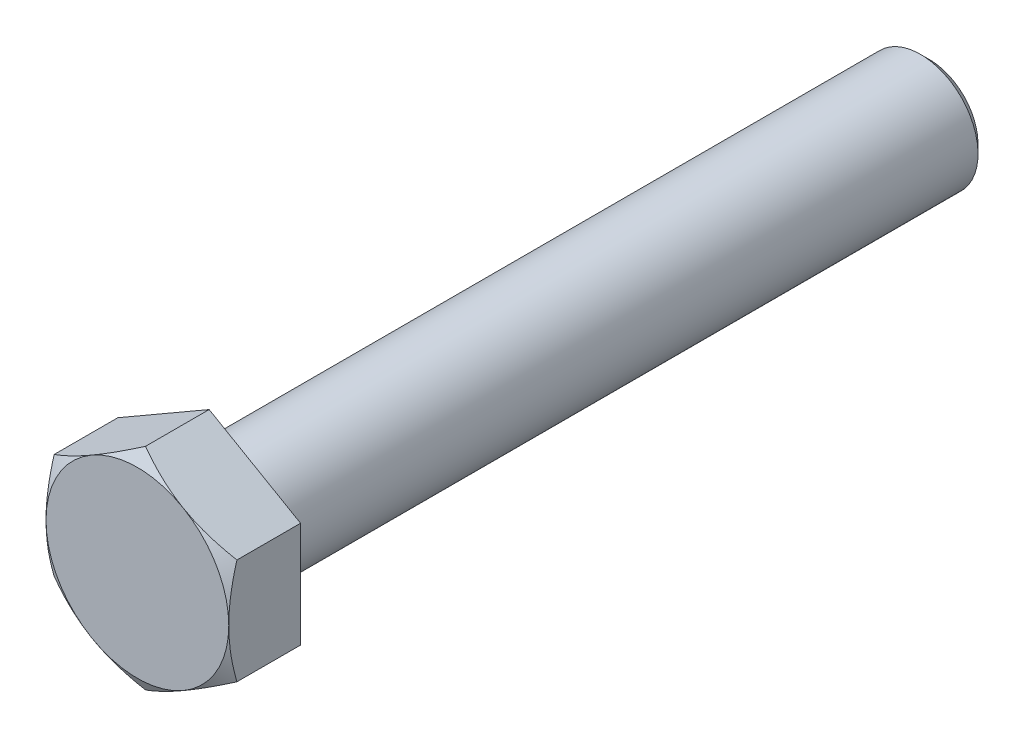
ISO-10303-21;
HEADER;
FILE_DESCRIPTION(('STEP AP214'),'2;1');
FILE_NAME('part.step','',(''),(''),'','','');
FILE_SCHEMA(('AUTOMOTIVE_DESIGN { 1 0 10303 214 1 1 1 1 }'));
ENDSEC;
DATA;
#1=APPLICATION_CONTEXT('core data for automotive mechanical design processes');
#2=APPLICATION_PROTOCOL_DEFINITION('international standard','automotive_design',2000,#1);
#3=PRODUCT_CONTEXT('',#1,'mechanical');
#4=PRODUCT('Part','Part','',(#3));
#5=PRODUCT_RELATED_PRODUCT_CATEGORY('part','',(#4));
#6=PRODUCT_DEFINITION_FORMATION('','',#4);
#7=PRODUCT_DEFINITION_CONTEXT('part definition',#1,'design');
#8=PRODUCT_DEFINITION('design','',#6,#7);
#9=PRODUCT_DEFINITION_SHAPE('','',#8);
#10=(LENGTH_UNIT() NAMED_UNIT(*) SI_UNIT(.MILLI.,.METRE.));
#11=(NAMED_UNIT(*) PLANE_ANGLE_UNIT() SI_UNIT($,.RADIAN.));
#12=(NAMED_UNIT(*) SI_UNIT($,.STERADIAN.) SOLID_ANGLE_UNIT());
#13=UNCERTAINTY_MEASURE_WITH_UNIT(LENGTH_MEASURE(1.E-05),#10,'distance_accuracy_value','');
#14=(GEOMETRIC_REPRESENTATION_CONTEXT(3) GLOBAL_UNCERTAINTY_ASSIGNED_CONTEXT((#13)) GLOBAL_UNIT_ASSIGNED_CONTEXT((#10,
#11,#12)) REPRESENTATION_CONTEXT('',''));
#15=CARTESIAN_POINT('',(0.,0.,0.));
#16=DIRECTION('',(0.,0.,1.));
#17=DIRECTION('',(1.,0.,0.));
#18=AXIS2_PLACEMENT_3D('',#15,#16,#17);
#19=CARTESIAN_POINT('',(0.,0.,0.));
#20=DIRECTION('',(0.,0.,1.));
#21=DIRECTION('',(1.,0.,0.));
#22=AXIS2_PLACEMENT_3D('',#19,#20,#21);
#23=PLANE('',#22);
#24=CARTESIAN_POINT('',(0.,0.,0.));
#25=DIRECTION('',(0.,0.,1.));
#26=DIRECTION('',(0.,-1.,0.));
#27=AXIS2_PLACEMENT_3D('',#24,#25,#26);
#28=CIRCLE('',#27,4.6);
#29=CARTESIAN_POINT('',(0.,-4.6,0.));
#30=VERTEX_POINT('',#29);
#31=EDGE_CURVE('E150',#30,#30,#28,.T.);
#32=ORIENTED_EDGE('',*,*,#31,.T.);
#33=EDGE_LOOP('',(#32));
#34=FACE_BOUND('',#33,.T.);
#35=CARTESIAN_POINT('',(0.,0.,0.));
#36=DIRECTION('',(0.,0.,1.));
#37=DIRECTION('',(1.,0.,0.));
#38=AXIS2_PLACEMENT_3D('',#35,#36,#37);
#39=CIRCLE('',#38,5.8);
#40=CARTESIAN_POINT('',(5.8,0.,0.));
#41=VERTEX_POINT('',#40);
#42=EDGE_CURVE('E296',#41,#41,#39,.T.);
#43=ORIENTED_EDGE('',*,*,#42,.F.);
#44=EDGE_LOOP('',(#43));
#45=FACE_BOUND('',#44,.T.);
#46=ADVANCED_FACE('F41',(#34,#45),#23,.F.);
#47=CARTESIAN_POINT('',(0.,0.,-0.6));
#48=DIRECTION('',(0.,0.,1.));
#49=DIRECTION('',(0.,-1.,0.));
#50=AXIS2_PLACEMENT_3D('',#47,#48,#49);
#51=TOROIDAL_SURFACE('',#50,4.6,0.600000000000001);
#52=ORIENTED_EDGE('',*,*,#31,.F.);
#53=EDGE_LOOP('',(#52));
#54=FACE_BOUND('',#53,.T.);
#55=CARTESIAN_POINT('',(0.,0.,-0.6));
#56=DIRECTION('',(0.,0.,1.));
#57=DIRECTION('',(0.,-1.,0.));
#58=AXIS2_PLACEMENT_3D('',#55,#56,#57);
#59=CIRCLE('',#58,4.);
#60=CARTESIAN_POINT('',(0.,-4.,-0.6));
#61=VERTEX_POINT('',#60);
#62=EDGE_CURVE('E153',#61,#61,#59,.T.);
#63=ORIENTED_EDGE('',*,*,#62,.T.);
#64=EDGE_LOOP('',(#63));
#65=FACE_BOUND('',#64,.T.);
#66=ADVANCED_FACE('F237',(#54,#65),#51,.F.);
#67=CARTESIAN_POINT('',(0.,0.,0.));
#68=DIRECTION('',(0.,0.,1.));
#69=DIRECTION('',(0.,-1.,0.));
#70=AXIS2_PLACEMENT_3D('',#67,#68,#69);
#71=CYLINDRICAL_SURFACE('',#70,4.);
#72=ORIENTED_EDGE('',*,*,#62,.F.);
#73=EDGE_LOOP('',(#72));
#74=FACE_BOUND('',#73,.T.);
#75=CARTESIAN_POINT('',(0.,0.,-49.4));
#76=DIRECTION('',(0.,0.,1.));
#77=DIRECTION('',(0.,-1.,0.));
#78=AXIS2_PLACEMENT_3D('',#75,#76,#77);
#79=CIRCLE('',#78,4.00000000000001);
#80=CARTESIAN_POINT('',(0.,-4.00000000000001,-49.4));
#81=VERTEX_POINT('',#80);
#82=EDGE_CURVE('E156',#81,#81,#79,.T.);
#83=ORIENTED_EDGE('',*,*,#82,.T.);
#84=EDGE_LOOP('',(#83));
#85=FACE_BOUND('',#84,.T.);
#86=ADVANCED_FACE('F243',(#74,#85),#71,.T.);
#87=CARTESIAN_POINT('',(0.,0.,-50.));
#88=DIRECTION('',(0.,0.,1.));
#89=DIRECTION('',(0.,-1.,0.));
#90=AXIS2_PLACEMENT_3D('',#87,#88,#89);
#91=CONICAL_SURFACE('',#90,3.4,0.785398163397444);
#92=ORIENTED_EDGE('',*,*,#82,.F.);
#93=EDGE_LOOP('',(#92));
#94=FACE_BOUND('',#93,.T.);
#95=CARTESIAN_POINT('',(0.,0.,-50.));
#96=DIRECTION('',(0.,0.,1.));
#97=DIRECTION('',(0.,-1.,0.));
#98=AXIS2_PLACEMENT_3D('',#95,#96,#97);
#99=CIRCLE('',#98,3.4);
#100=CARTESIAN_POINT('',(0.,-3.4,-50.));
#101=VERTEX_POINT('',#100);
#102=EDGE_CURVE('E129',#101,#101,#99,.T.);
#103=ORIENTED_EDGE('',*,*,#102,.T.);
#104=EDGE_LOOP('',(#103));
#105=FACE_BOUND('',#104,.T.);
#106=ADVANCED_FACE('F310',(#94,#105),#91,.T.);
#107=CARTESIAN_POINT('',(0.,3.4,-50.));
#108=DIRECTION('',(0.,0.,1.));
#109=DIRECTION('',(0.,-1.,0.));
#110=AXIS2_PLACEMENT_3D('',#107,#108,#109);
#111=PLANE('',#110);
#112=ORIENTED_EDGE('',*,*,#102,.F.);
#113=EDGE_LOOP('',(#112));
#114=FACE_BOUND('',#113,.T.);
#115=ADVANCED_FACE('F306',(#114),#111,.F.);
#116=CARTESIAN_POINT('',(0.,7.34966892678394,0.150000000000001));
#117=DIRECTION('',(0.,0.,-1.));
#118=DIRECTION('',(-1.,0.,0.));
#119=AXIS2_PLACEMENT_3D('',#116,#117,#118);
#120=PLANE('',#119);
#121=CARTESIAN_POINT('',(0.,0.,0.150000000000001));
#122=DIRECTION('',(0.,0.,1.));
#123=DIRECTION('',(1.,0.,0.));
#124=AXIS2_PLACEMENT_3D('',#121,#122,#123);
#125=CIRCLE('',#124,5.88660254037844);
#126=CARTESIAN_POINT('',(5.88660254037844,0.,0.150000000000001));
#127=VERTEX_POINT('',#126);
#128=EDGE_CURVE('E293',#127,#127,#125,.T.);
#129=ORIENTED_EDGE('',*,*,#128,.T.);
#130=EDGE_LOOP('',(#129));
#131=FACE_BOUND('',#130,.T.);
#132=DIRECTION('',(0.866025403784439,-0.5,0.));
#133=VECTOR('',#132,1.);
#134=CARTESIAN_POINT('',(6.365,3.67483446339197,0.150000000000001));
#135=LINE('',#134,#133);
#136=CARTESIAN_POINT('',(0.,7.34966892678394,0.150000000000001));
#137=VERTEX_POINT('',#136);
#138=CARTESIAN_POINT('',(6.365,3.67483446339197,0.150000000000003));
#139=VERTEX_POINT('',#138);
#140=EDGE_CURVE('E64',#137,#139,#135,.T.);
#141=ORIENTED_EDGE('',*,*,#140,.T.);
#142=DIRECTION('',(0.,-1.,0.));
#143=VECTOR('',#142,1.);
#144=CARTESIAN_POINT('',(6.365,-3.67483446339197,0.150000000000001));
#145=LINE('',#144,#143);
#146=CARTESIAN_POINT('',(6.365,-3.67483446339197,0.150000000000001));
#147=VERTEX_POINT('',#146);
#148=EDGE_CURVE('E11',#139,#147,#145,.T.);
#149=ORIENTED_EDGE('',*,*,#148,.T.);
#150=DIRECTION('',(-0.866025403784439,-0.5,0.));
#151=VECTOR('',#150,1.);
#152=CARTESIAN_POINT('',(0.,-7.34966892678394,0.150000000000001));
#153=LINE('',#152,#151);
#154=CARTESIAN_POINT('',(0.,-7.34966892678394,0.150000000000001));
#155=VERTEX_POINT('',#154);
#156=EDGE_CURVE('E164',#147,#155,#153,.T.);
#157=ORIENTED_EDGE('',*,*,#156,.T.);
#158=DIRECTION('',(-0.866025403784438,0.5,0.));
#159=VECTOR('',#158,1.);
#160=CARTESIAN_POINT('',(-6.365,-3.67483446339197,0.150000000000001));
#161=LINE('',#160,#159);
#162=CARTESIAN_POINT('',(-6.365,-3.67483446339197,0.150000000000001));
#163=VERTEX_POINT('',#162);
#164=EDGE_CURVE('E162',#155,#163,#161,.T.);
#165=ORIENTED_EDGE('',*,*,#164,.T.);
#166=DIRECTION('',(0.,1.,0.));
#167=VECTOR('',#166,1.);
#168=CARTESIAN_POINT('',(-6.365,3.67483446339197,0.150000000000001));
#169=LINE('',#168,#167);
#170=CARTESIAN_POINT('',(-6.365,3.67483446339197,0.150000000000001));
#171=VERTEX_POINT('',#170);
#172=EDGE_CURVE('E115',#163,#171,#169,.T.);
#173=ORIENTED_EDGE('',*,*,#172,.T.);
#174=DIRECTION('',(0.866025403784439,0.5,0.));
#175=VECTOR('',#174,1.);
#176=CARTESIAN_POINT('',(0.,7.34966892678394,0.150000000000001));
#177=LINE('',#176,#175);
#178=EDGE_CURVE('E112',#171,#137,#177,.T.);
#179=ORIENTED_EDGE('',*,*,#178,.T.);
#180=EDGE_LOOP('',(#141,#149,#157,#165,#173,#179));
#181=FACE_BOUND('',#180,.T.);
#182=ADVANCED_FACE('F113',(#131,#181),#120,.T.);
#183=CARTESIAN_POINT('',(0.,0.,0.150000000000001));
#184=DIRECTION('',(0.,0.,1.));
#185=DIRECTION('',(1.,0.,0.));
#186=AXIS2_PLACEMENT_3D('',#183,#184,#185);
#187=CONICAL_SURFACE('',#186,5.88660254037844,0.523598775598302);
#188=ORIENTED_EDGE('',*,*,#42,.T.);
#189=EDGE_LOOP('',(#188));
#190=FACE_BOUND('',#189,.T.);
#191=ORIENTED_EDGE('',*,*,#128,.F.);
#192=EDGE_LOOP('',(#191));
#193=FACE_BOUND('',#192,.T.);
#194=ADVANCED_FACE('F188',(#190,#193),#187,.T.);
#195=CARTESIAN_POINT('',(6.365,-3.67483446339197,5.15));
#196=DIRECTION('',(-1.,0.,0.));
#197=DIRECTION('',(0.,0.,1.));
#198=AXIS2_PLACEMENT_3D('',#195,#196,#197);
#199=PLANE('',#198);
#200=CARTESIAN_POINT('',(6.365,-9.74620255402201,2.10417752070093));
#201=CARTESIAN_POINT('',(6.365,-9.466743061924,2.23922778450705));
#202=CARTESIAN_POINT('',(6.365,-9.18662283336427,2.37293553637398));
#203=CARTESIAN_POINT('',(6.365,-8.62470364838083,2.63689885997666));
#204=CARTESIAN_POINT('',(6.365,-8.34290441151386,2.76715383400582));
#205=CARTESIAN_POINT('',(6.365,-7.77574769826276,3.02413063602513));
#206=CARTESIAN_POINT('',(6.365,-7.49037908790233,3.15082797964364));
#207=CARTESIAN_POINT('',(6.365,-6.91729637209056,3.39878070466244));
#208=CARTESIAN_POINT('',(6.365,-6.62958238982508,3.52003636972724));
#209=CARTESIAN_POINT('',(6.365,-6.04777966328442,3.75709828240193));
#210=CARTESIAN_POINT('',(6.365,-5.75365602159666,3.87281935215871));
#211=CARTESIAN_POINT('',(6.365,-5.16193930006325,4.09519817931673));
#212=CARTESIAN_POINT('',(6.365,-4.864345838395,4.20185492835972));
#213=CARTESIAN_POINT('',(6.365,-4.26582830474239,4.40323957299992));
#214=CARTESIAN_POINT('',(6.365,-3.96491285237291,4.49799282927845));
#215=CARTESIAN_POINT('',(6.365,-3.35880092538506,4.67249210660028));
#216=CARTESIAN_POINT('',(6.365,-3.05360583750632,4.75224287346636));
#217=CARTESIAN_POINT('',(6.365,-2.4387408862867,4.89286958916527));
#218=CARTESIAN_POINT('',(6.365,-2.12906985440494,4.95374051233359));
#219=CARTESIAN_POINT('',(6.365,-1.50595084883235,5.05249385747353));
#220=CARTESIAN_POINT('',(6.365,-1.19250287180248,5.0903762591204));
#221=CARTESIAN_POINT('',(6.365,-0.721832091587363,5.12753002038573));
#222=CARTESIAN_POINT('',(6.365,-0.565346043942449,5.13663818585123));
#223=CARTESIAN_POINT('',(6.365,-0.252121475645643,5.14822358924696));
#224=CARTESIAN_POINT('',(6.365,-0.0953829582988802,5.15070091328813));
#225=CARTESIAN_POINT('',(6.365,0.218011475278281,5.14895808707227));
#226=CARTESIAN_POINT('',(6.365,0.374667402345122,5.14473981644265));
#227=CARTESIAN_POINT('',(6.365,0.687665429465813,5.12971270573269));
#228=CARTESIAN_POINT('',(6.365,0.84400751345634,5.11890353652779));
#229=CARTESIAN_POINT('',(6.365,1.22293245370947,5.08494297431608));
#230=CARTESIAN_POINT('',(6.365,1.445224118384,5.05848904503914));
#231=CARTESIAN_POINT('',(6.365,1.88810410746324,4.99372467120738));
#232=CARTESIAN_POINT('',(6.365,2.10869195007896,4.95541099043317));
#233=CARTESIAN_POINT('',(6.365,2.54798223572799,4.86828591240334));
#234=CARTESIAN_POINT('',(6.365,2.76668269133518,4.81946458949067));
#235=CARTESIAN_POINT('',(6.365,3.20183348991462,4.71281384098773));
#236=CARTESIAN_POINT('',(6.365,3.41828404281129,4.65498526400403));
#237=CARTESIAN_POINT('',(6.365,3.85426615972078,4.53019185361869));
#238=CARTESIAN_POINT('',(6.365,4.07374319251582,4.46303781689891));
#239=CARTESIAN_POINT('',(6.365,4.5103773806417,4.32209453671705));
#240=CARTESIAN_POINT('',(6.365,4.72753602208682,4.24830986982301));
#241=CARTESIAN_POINT('',(6.365,5.15866204869266,4.09562942366593));
#242=CARTESIAN_POINT('',(6.365,5.37264051637927,4.01676475081889));
#243=CARTESIAN_POINT('',(6.365,5.79893727559048,3.85440649793558));
#244=CARTESIAN_POINT('',(6.365,6.01125485600017,3.77091104705295));
#245=CARTESIAN_POINT('',(6.365,6.22280111012557,3.68555829334041));
#246=B_SPLINE_CURVE_WITH_KNOTS('',3,(#200,#201,#202,#203,#204,#205,#206,#207,#208,#209,#210,
#211,#212,#213,#214,#215,#216,#217,#218,#219,#220,#221,#222,#223,#224,#225,#226,#227,#228,#229,
#230,#231,#232,#233,#234,#235,#236,#237,#238,#239,#240,#241,#242,#243,#244,#245),.UNSPECIFIED.,
.F.,.F.,(4,2,2,2,2,2,2,2,2,2,2,2,2,2,2,2,2,2,2,2,2,2,4),(0.,0.931154614866976,1.86246938194105,
2.79911368730425,3.73570911030725,4.68380301837242,5.63200225924,6.57814578450031,
7.52398950564165,8.47008478721693,9.41618090525813,9.88631422449018,10.3564414383406,
10.8264366986048,11.2964554305782,11.9676621628092,12.6390522116941,13.3110792699478,
13.9830430523123,14.6714781192221,15.3594416141425,16.0435327883289,16.7279023793783),.UNSPECIFIED.);
#247=CARTESIAN_POINT('',(6.365,-3.67483446339197,4.58150113005864));
#248=VERTEX_POINT('',#247);
#249=CARTESIAN_POINT('',(6.365,0.,5.15));
#250=VERTEX_POINT('',#249);
#251=EDGE_CURVE('E291',#248,#250,#246,.T.);
#252=ORIENTED_EDGE('',*,*,#251,.F.);
#253=DIRECTION('',(0.,0.,-1.));
#254=VECTOR('',#253,1.);
#255=CARTESIAN_POINT('',(6.365,-3.67483446339197,5.15));
#256=LINE('',#255,#254);
#257=EDGE_CURVE('E146',#248,#147,#256,.T.);
#258=ORIENTED_EDGE('',*,*,#257,.T.);
#259=ORIENTED_EDGE('',*,*,#148,.F.);
#260=DIRECTION('',(0.,0.,-1.));
#261=VECTOR('',#260,1.);
#262=CARTESIAN_POINT('',(6.365,3.67483446339197,5.15));
#263=LINE('',#262,#261);
#264=CARTESIAN_POINT('',(6.365,3.67483446339197,4.58150113005864));
#265=VERTEX_POINT('',#264);
#266=EDGE_CURVE('E128',#265,#139,#263,.T.);
#267=ORIENTED_EDGE('',*,*,#266,.F.);
#268=EDGE_CURVE('E193',#250,#265,#246,.T.);
#269=ORIENTED_EDGE('',*,*,#268,.F.);
#270=EDGE_LOOP('',(#252,#258,#259,#267,#269));
#271=FACE_BOUND('',#270,.T.);
#272=ADVANCED_FACE('F248',(#271),#199,.F.);
#273=CARTESIAN_POINT('',(0.,-7.34966892678394,5.15));
#274=DIRECTION('',(-0.5,0.866025403784439,0.));
#275=DIRECTION('',(-0.866025403784439,-0.5,0.));
#276=AXIS2_PLACEMENT_3D('',#273,#274,#275);
#277=PLANE('',#276);
#278=CARTESIAN_POINT('',(-0.000200000000001205,-7.34978439683778,4.58143446182091));
#279=CARTESIAN_POINT('',(0.139710039115643,-7.26900729809203,4.6280643413956));
#280=CARTESIAN_POINT('',(0.280141730709852,-7.18792902314736,4.67257800061253));
#281=CARTESIAN_POINT('',(0.562145571657771,-7.02511402966357,4.75679002639063));
#282=CARTESIAN_POINT('',(0.703718185116129,-6.94337704317351,4.79648631569877));
#283=CARTESIAN_POINT('',(1.13070279037378,-6.69685736638818,4.90756995845888));
#284=CARTESIAN_POINT('',(1.41780023937635,-6.53110157692289,4.97075318530501));
#285=CARTESIAN_POINT('',(1.84743635075536,-6.28305105236463,5.04484317711931));
#286=CARTESIAN_POINT('',(1.9886912977997,-6.20149747066422,5.0659493132145));
#287=CARTESIAN_POINT('',(2.27183945542866,-6.03802180563659,5.10134132834389));
#288=CARTESIAN_POINT('',(2.41373260850058,-5.95609975551435,5.11562780998361));
#289=CARTESIAN_POINT('',(2.6977653589495,-5.792113370584,5.13701642089907));
#290=CARTESIAN_POINT('',(2.83990449241902,-5.71004930361299,5.1441267036469));
#291=CARTESIAN_POINT('',(3.12430622079744,-5.54584988917572,5.15101808099618));
#292=CARTESIAN_POINT('',(3.26656881175663,-5.46371454398981,5.15079940200902));
#293=CARTESIAN_POINT('',(3.65632359139324,-5.23868951704867,5.14012613527418));
#294=CARTESIAN_POINT('',(3.90368820112705,-5.09587349303087,5.1222078418454));
#295=CARTESIAN_POINT('',(4.39677444253791,-4.81119001881861,5.06538838058255));
#296=CARTESIAN_POINT('',(4.64249434006573,-4.66932356983568,5.02646779156689));
#297=CARTESIAN_POINT('',(5.13657294389504,-4.38406715491399,4.92917745645478));
#298=CARTESIAN_POINT('',(5.38486930573046,-4.24071318356951,4.87039549497283));
#299=CARTESIAN_POINT('',(5.87775919646686,-3.956143072472,4.73698409890944));
#300=CARTESIAN_POINT('',(6.12235903782157,-3.81492328822212,4.66238600278679));
#301=CARTESIAN_POINT('',(6.3652,-3.67471899333814,4.58143446182091));
#302=B_SPLINE_CURVE_WITH_KNOTS('',3,(#278,#279,#280,#281,#282,#283,#284,#285,#286,#287,#288,
#289,#290,#291,#292,#293,#294,#295,#296,#297,#298,#299,#300,#301),.UNSPECIFIED.,.F.,.F.,(4,2,2,
2,2,2,2,2,2,2,2,4),(0.,0.504406880784759,1.00903049509045,2.02037460639605,2.51366063649745,
3.00690307026488,3.49958445754648,3.99225062458519,4.84993121388198,5.70840627760013,
6.58592135712847,7.46171369114761),.UNSPECIFIED.);
#303=CARTESIAN_POINT('',(0.,-7.34966892678394,4.58150113005864));
#304=VERTEX_POINT('',#303);
#305=CARTESIAN_POINT('',(3.1825,-5.51225169508795,5.15));
#306=VERTEX_POINT('',#305);
#307=EDGE_CURVE('E262',#304,#306,#302,.T.);
#308=ORIENTED_EDGE('',*,*,#307,.F.);
#309=DIRECTION('',(0.,0.,-1.));
#310=VECTOR('',#309,1.);
#311=CARTESIAN_POINT('',(0.,-7.34966892678394,5.15));
#312=LINE('',#311,#310);
#313=EDGE_CURVE('E143',#304,#155,#312,.T.);
#314=ORIENTED_EDGE('',*,*,#313,.T.);
#315=ORIENTED_EDGE('',*,*,#156,.F.);
#316=ORIENTED_EDGE('',*,*,#257,.F.);
#317=EDGE_CURVE('E203',#306,#248,#302,.T.);
#318=ORIENTED_EDGE('',*,*,#317,.F.);
#319=EDGE_LOOP('',(#308,#314,#315,#316,#318));
#320=FACE_BOUND('',#319,.T.);
#321=ADVANCED_FACE('F251',(#320),#277,.F.);
#322=CARTESIAN_POINT('',(-6.365,-3.67483446339197,5.15));
#323=DIRECTION('',(0.5,0.866025403784439,0.));
#324=DIRECTION('',(-0.866025403784438,0.5,0.));
#325=AXIS2_PLACEMENT_3D('',#322,#323,#324);
#326=PLANE('',#325);
#327=CARTESIAN_POINT('',(-6.3652,-3.67471899333813,4.58143446182091));
#328=CARTESIAN_POINT('',(-6.22528996088436,-3.75549609208388,4.6280643413956));
#329=CARTESIAN_POINT('',(-6.08485826929015,-3.83657436702855,4.67257800061253));
#330=CARTESIAN_POINT('',(-5.80285442834223,-3.99938936051234,4.75679002639063));
#331=CARTESIAN_POINT('',(-5.66128181488387,-4.0811263470024,4.79648631569877));
#332=CARTESIAN_POINT('',(-5.23429720962622,-4.32764602378773,4.90756995845888));
#333=CARTESIAN_POINT('',(-4.94719976062365,-4.49340181325302,4.97075318530501));
#334=CARTESIAN_POINT('',(-4.51756364924464,-4.74145233781128,5.04484317711931));
#335=CARTESIAN_POINT('',(-4.3763087022003,-4.8230059195117,5.0659493132145));
#336=CARTESIAN_POINT('',(-4.09316054457134,-4.98648158453932,5.10134132834389));
#337=CARTESIAN_POINT('',(-3.95126739149942,-5.06840363466156,5.11562780998361));
#338=CARTESIAN_POINT('',(-3.6672346410505,-5.23239001959191,5.13701642089907));
#339=CARTESIAN_POINT('',(-3.52509550758098,-5.31445408656292,5.14412670364691));
#340=CARTESIAN_POINT('',(-3.24069377920256,-5.4786535010002,5.15101808099618));
#341=CARTESIAN_POINT('',(-3.09843118824337,-5.5607888461861,5.15079940200902));
#342=CARTESIAN_POINT('',(-2.70867640860676,-5.78581387312724,5.14012613527418));
#343=CARTESIAN_POINT('',(-2.46131179887295,-5.92862989714504,5.1222078418454));
#344=CARTESIAN_POINT('',(-1.96822555746209,-6.2133133713573,5.06538838058255));
#345=CARTESIAN_POINT('',(-1.72250565993427,-6.35517982034023,5.02646779156689));
#346=CARTESIAN_POINT('',(-1.22842705610496,-6.64043623526192,4.92917745645478));
#347=CARTESIAN_POINT('',(-0.980130694269542,-6.7837902066064,4.87039549497283));
#348=CARTESIAN_POINT('',(-0.487240803533137,-7.06836031770391,4.73698409890944));
#349=CARTESIAN_POINT('',(-0.242640962178432,-7.20958010195379,4.66238600278679));
#350=CARTESIAN_POINT('',(0.000199999999998607,-7.34978439683778,4.58143446182091));
#351=B_SPLINE_CURVE_WITH_KNOTS('',3,(#327,#328,#329,#330,#331,#332,#333,#334,#335,#336,#337,
#338,#339,#340,#341,#342,#343,#344,#345,#346,#347,#348,#349,#350),.UNSPECIFIED.,.F.,.F.,(4,2,2,
2,2,2,2,2,2,2,2,4),(0.,0.504406880784758,1.00903049509045,2.02037460639605,2.51366063649745,
3.00690307026488,3.49958445754648,3.99225062458519,4.84993121388198,5.70840627760013,
6.58592135712847,7.46171369114762),.UNSPECIFIED.);
#352=CARTESIAN_POINT('',(-6.365,-3.67483446339197,4.58150113005864));
#353=VERTEX_POINT('',#352);
#354=CARTESIAN_POINT('',(-3.1825,-5.51225169508795,5.15));
#355=VERTEX_POINT('',#354);
#356=EDGE_CURVE('E224',#353,#355,#351,.T.);
#357=ORIENTED_EDGE('',*,*,#356,.F.);
#358=DIRECTION('',(0.,0.,-1.));
#359=VECTOR('',#358,1.);
#360=CARTESIAN_POINT('',(-6.365,-3.67483446339197,5.15));
#361=LINE('',#360,#359);
#362=EDGE_CURVE('E138',#353,#163,#361,.T.);
#363=ORIENTED_EDGE('',*,*,#362,.T.);
#364=ORIENTED_EDGE('',*,*,#164,.F.);
#365=ORIENTED_EDGE('',*,*,#313,.F.);
#366=EDGE_CURVE('E211',#355,#304,#351,.T.);
#367=ORIENTED_EDGE('',*,*,#366,.F.);
#368=EDGE_LOOP('',(#357,#363,#364,#365,#367));
#369=FACE_BOUND('',#368,.T.);
#370=ADVANCED_FACE('F228',(#369),#326,.F.);
#371=CARTESIAN_POINT('',(-6.365,3.67483446339197,5.15));
#372=DIRECTION('',(1.,0.,0.));
#373=DIRECTION('',(0.,0.,-1.));
#374=AXIS2_PLACEMENT_3D('',#371,#372,#373);
#375=PLANE('',#374);
#376=CARTESIAN_POINT('',(-6.365,-9.74620255402201,2.10417752070093));
#377=CARTESIAN_POINT('',(-6.365,-9.466743061924,2.23922778450705));
#378=CARTESIAN_POINT('',(-6.365,-9.18662283336426,2.37293553637398));
#379=CARTESIAN_POINT('',(-6.365,-8.62470364838082,2.63689885997667));
#380=CARTESIAN_POINT('',(-6.365,-8.34290441151386,2.76715383400582));
#381=CARTESIAN_POINT('',(-6.365,-7.77574769826275,3.02413063602513));
#382=CARTESIAN_POINT('',(-6.365,-7.49037908790233,3.15082797964364));
#383=CARTESIAN_POINT('',(-6.365,-6.91729637209056,3.39878070466244));
#384=CARTESIAN_POINT('',(-6.365,-6.62958238982508,3.52003636972723));
#385=CARTESIAN_POINT('',(-6.365,-6.04777966328442,3.75709828240193));
#386=CARTESIAN_POINT('',(-6.365,-5.75365602159666,3.87281935215871));
#387=CARTESIAN_POINT('',(-6.365,-5.16193930006325,4.09519817931673));
#388=CARTESIAN_POINT('',(-6.365,-4.864345838395,4.20185492835972));
#389=CARTESIAN_POINT('',(-6.365,-4.26582830474239,4.40323957299991));
#390=CARTESIAN_POINT('',(-6.365,-3.96491285237291,4.49799282927845));
#391=CARTESIAN_POINT('',(-6.365,-3.35880092538506,4.67249210660028));
#392=CARTESIAN_POINT('',(-6.365,-3.05360583750632,4.75224287346636));
#393=CARTESIAN_POINT('',(-6.365,-2.4387408862867,4.89286958916527));
#394=CARTESIAN_POINT('',(-6.365,-2.12906985440494,4.95374051233359));
#395=CARTESIAN_POINT('',(-6.365,-1.50595084883235,5.05249385747353));
#396=CARTESIAN_POINT('',(-6.365,-1.19250287180248,5.0903762591204));
#397=CARTESIAN_POINT('',(-6.365,-0.721832091587358,5.12753002038573));
#398=CARTESIAN_POINT('',(-6.365,-0.565346043942445,5.13663818585123));
#399=CARTESIAN_POINT('',(-6.365,-0.252121475645639,5.14822358924696));
#400=CARTESIAN_POINT('',(-6.365,-0.095382958298876,5.15070091328813));
#401=CARTESIAN_POINT('',(-6.365,0.218011475278285,5.14895808707227));
#402=CARTESIAN_POINT('',(-6.365,0.374667402345127,5.14473981644265));
#403=CARTESIAN_POINT('',(-6.365,0.687665429465817,5.12971270573269));
#404=CARTESIAN_POINT('',(-6.365,0.844007513456344,5.11890353652778));
#405=CARTESIAN_POINT('',(-6.365,1.22293245370947,5.08494297431608));
#406=CARTESIAN_POINT('',(-6.365,1.445224118384,5.05848904503914));
#407=CARTESIAN_POINT('',(-6.365,1.88810410746324,4.99372467120738));
#408=CARTESIAN_POINT('',(-6.365,2.10869195007896,4.95541099043317));
#409=CARTESIAN_POINT('',(-6.365,2.547982235728,4.86828591240333));
#410=CARTESIAN_POINT('',(-6.365,2.76668269133518,4.81946458949066));
#411=CARTESIAN_POINT('',(-6.365,3.20183348991462,4.71281384098773));
#412=CARTESIAN_POINT('',(-6.365,3.4182840428113,4.65498526400403));
#413=CARTESIAN_POINT('',(-6.365,3.85426615972079,4.53019185361869));
#414=CARTESIAN_POINT('',(-6.365,4.07374319251582,4.46303781689891));
#415=CARTESIAN_POINT('',(-6.365,4.51037738064171,4.32209453671705));
#416=CARTESIAN_POINT('',(-6.365,4.72753602208682,4.24830986982301));
#417=CARTESIAN_POINT('',(-6.365,5.15866204869267,4.09562942366593));
#418=CARTESIAN_POINT('',(-6.365,5.37264051637927,4.01676475081889));
#419=CARTESIAN_POINT('',(-6.365,5.79893727559048,3.85440649793558));
#420=CARTESIAN_POINT('',(-6.365,6.01125485600018,3.77091104705295));
#421=CARTESIAN_POINT('',(-6.365,6.22280111012558,3.6855582933404));
#422=B_SPLINE_CURVE_WITH_KNOTS('',3,(#376,#377,#378,#379,#380,#381,#382,#383,#384,#385,#386,
#387,#388,#389,#390,#391,#392,#393,#394,#395,#396,#397,#398,#399,#400,#401,#402,#403,#404,#405,
#406,#407,#408,#409,#410,#411,#412,#413,#414,#415,#416,#417,#418,#419,#420,#421),.UNSPECIFIED.,
.F.,.F.,(4,2,2,2,2,2,2,2,2,2,2,2,2,2,2,2,2,2,2,2,2,2,4),(0.,0.931154614866976,1.86246938194105,
2.79911368730425,3.73570911030724,4.68380301837242,5.63200225923999,6.57814578450031,
7.52398950564165,8.47008478721693,9.41618090525813,9.88631422449018,10.3564414383406,
10.8264366986048,11.2964554305782,11.9676621628092,12.6390522116941,13.3110792699478,
13.9830430523123,14.6714781192221,15.3594416141425,16.0435327883289,16.7279023793783),.UNSPECIFIED.);
#423=CARTESIAN_POINT('',(-6.365,3.67483446339197,4.58150113005864));
#424=VERTEX_POINT('',#423);
#425=CARTESIAN_POINT('',(-6.365,0.,5.15));
#426=VERTEX_POINT('',#425);
#427=EDGE_CURVE('E223',#424,#426,#422,.F.);
#428=ORIENTED_EDGE('',*,*,#427,.F.);
#429=DIRECTION('',(0.,0.,-1.));
#430=VECTOR('',#429,1.);
#431=CARTESIAN_POINT('',(-6.365,3.67483446339197,5.15));
#432=LINE('',#431,#430);
#433=EDGE_CURVE('E135',#424,#171,#432,.T.);
#434=ORIENTED_EDGE('',*,*,#433,.T.);
#435=ORIENTED_EDGE('',*,*,#172,.F.);
#436=ORIENTED_EDGE('',*,*,#362,.F.);
#437=EDGE_CURVE('E217',#426,#353,#422,.F.);
#438=ORIENTED_EDGE('',*,*,#437,.F.);
#439=EDGE_LOOP('',(#428,#434,#435,#436,#438));
#440=FACE_BOUND('',#439,.T.);
#441=ADVANCED_FACE('F225',(#440),#375,.F.);
#442=CARTESIAN_POINT('',(0.,7.34966892678394,5.15));
#443=DIRECTION('',(0.5,-0.866025403784439,0.));
#444=DIRECTION('',(0.866025403784439,0.5,0.));
#445=AXIS2_PLACEMENT_3D('',#442,#443,#444);
#446=PLANE('',#445);
#447=CARTESIAN_POINT('',(0.000200000000001834,7.34978439683777,4.58143446182091));
#448=CARTESIAN_POINT('',(-0.139710039115642,7.26900729809203,4.6280643413956));
#449=CARTESIAN_POINT('',(-0.280141730709851,7.18792902314735,4.67257800061253));
#450=CARTESIAN_POINT('',(-0.56214557165777,7.02511402966357,4.75679002639063));
#451=CARTESIAN_POINT('',(-0.703718185116128,6.9433770431735,4.79648631569877));
#452=CARTESIAN_POINT('',(-1.13070279037378,6.69685736638817,4.90756995845888));
#453=CARTESIAN_POINT('',(-1.41780023937635,6.53110157692288,4.97075318530501));
#454=CARTESIAN_POINT('',(-1.84743635075535,6.28305105236463,5.04484317711932));
#455=CARTESIAN_POINT('',(-1.9886912977997,6.20149747066421,5.0659493132145));
#456=CARTESIAN_POINT('',(-2.27183945542866,6.03802180563659,5.10134132834389));
#457=CARTESIAN_POINT('',(-2.41373260850058,5.95609975551435,5.11562780998362));
#458=CARTESIAN_POINT('',(-2.6977653589495,5.792113370584,5.13701642089907));
#459=CARTESIAN_POINT('',(-2.83990449241902,5.71004930361299,5.14412670364691));
#460=CARTESIAN_POINT('',(-3.12430622079744,5.54584988917571,5.15101808099618));
#461=CARTESIAN_POINT('',(-3.26656881175663,5.46371454398981,5.15079940200902));
#462=CARTESIAN_POINT('',(-3.65632359139324,5.23868951704867,5.14012613527418));
#463=CARTESIAN_POINT('',(-3.90368820112705,5.09587349303087,5.1222078418454));
#464=CARTESIAN_POINT('',(-4.3967744425379,4.81119001881861,5.06538838058255));
#465=CARTESIAN_POINT('',(-4.64249434006573,4.66932356983568,5.0264677915669));
#466=CARTESIAN_POINT('',(-5.13657294389504,4.38406715491398,4.92917745645479));
#467=CARTESIAN_POINT('',(-5.38486930573046,4.2407131835695,4.87039549497283));
#468=CARTESIAN_POINT('',(-5.87775919646686,3.95614307247199,4.73698409890945));
#469=CARTESIAN_POINT('',(-6.12235903782157,3.81492328822211,4.66238600278679));
#470=CARTESIAN_POINT('',(-6.3652,3.67471899333813,4.58143446182091));
#471=B_SPLINE_CURVE_WITH_KNOTS('',3,(#447,#448,#449,#450,#451,#452,#453,#454,#455,#456,#457,
#458,#459,#460,#461,#462,#463,#464,#465,#466,#467,#468,#469,#470),.UNSPECIFIED.,.F.,.F.,(4,2,2,
2,2,2,2,2,2,2,2,4),(0.,0.504406880784758,1.00903049509045,2.02037460639605,2.51366063649744,
3.00690307026488,3.49958445754648,3.99225062458519,4.84993121388198,5.70840627760013,
6.58592135712847,7.46171369114762),.UNSPECIFIED.);
#472=CARTESIAN_POINT('',(0.,7.34966892678394,4.58150113005864));
#473=VERTEX_POINT('',#472);
#474=CARTESIAN_POINT('',(-3.1825,5.51225169508795,5.15));
#475=VERTEX_POINT('',#474);
#476=EDGE_CURVE('E134',#473,#475,#471,.T.);
#477=ORIENTED_EDGE('',*,*,#476,.F.);
#478=DIRECTION('',(0.,0.,-1.));
#479=VECTOR('',#478,1.);
#480=CARTESIAN_POINT('',(0.,7.34966892678394,5.15));
#481=LINE('',#480,#479);
#482=EDGE_CURVE('E126',#473,#137,#481,.T.);
#483=ORIENTED_EDGE('',*,*,#482,.T.);
#484=ORIENTED_EDGE('',*,*,#178,.F.);
#485=ORIENTED_EDGE('',*,*,#433,.F.);
#486=EDGE_CURVE('E174',#475,#424,#471,.T.);
#487=ORIENTED_EDGE('',*,*,#486,.F.);
#488=EDGE_LOOP('',(#477,#483,#484,#485,#487));
#489=FACE_BOUND('',#488,.T.);
#490=ADVANCED_FACE('F132',(#489),#446,.F.);
#491=CARTESIAN_POINT('',(6.365,3.67483446339197,5.15));
#492=DIRECTION('',(-0.5,-0.866025403784439,0.));
#493=DIRECTION('',(0.866025403784439,-0.5,0.));
#494=AXIS2_PLACEMENT_3D('',#491,#492,#493);
#495=PLANE('',#494);
#496=CARTESIAN_POINT('',(6.3652,3.67471899333813,4.58143446182091));
#497=CARTESIAN_POINT('',(6.22528996088436,3.75549609208388,4.6280643413956));
#498=CARTESIAN_POINT('',(6.08485826929015,3.83657436702855,4.67257800061253));
#499=CARTESIAN_POINT('',(5.80285442834223,3.99938936051234,4.75679002639063));
#500=CARTESIAN_POINT('',(5.66128181488387,4.0811263470024,4.79648631569877));
#501=CARTESIAN_POINT('',(5.23429720962622,4.32764602378773,4.90756995845888));
#502=CARTESIAN_POINT('',(4.94719976062365,4.49340181325302,4.97075318530501));
#503=CARTESIAN_POINT('',(4.51756364924464,4.74145233781127,5.04484317711932));
#504=CARTESIAN_POINT('',(4.3763087022003,4.82300591951169,5.0659493132145));
#505=CARTESIAN_POINT('',(4.09316054457134,4.98648158453932,5.10134132834389));
#506=CARTESIAN_POINT('',(3.95126739149941,5.06840363466156,5.11562780998361));
#507=CARTESIAN_POINT('',(3.6672346410505,5.23239001959191,5.13701642089907));
#508=CARTESIAN_POINT('',(3.52509550758098,5.31445408656292,5.1441267036469));
#509=CARTESIAN_POINT('',(3.24069377920256,5.4786535010002,5.15101808099618));
#510=CARTESIAN_POINT('',(3.09843118824337,5.5607888461861,5.15079940200902));
#511=CARTESIAN_POINT('',(2.70867640860676,5.78581387312724,5.14012613527418));
#512=CARTESIAN_POINT('',(2.46131179887295,5.92862989714504,5.1222078418454));
#513=CARTESIAN_POINT('',(1.96822555746209,6.2133133713573,5.06538838058255));
#514=CARTESIAN_POINT('',(1.72250565993427,6.35517982034023,5.02646779156689));
#515=CARTESIAN_POINT('',(1.22842705610496,6.64043623526192,4.92917745645478));
#516=CARTESIAN_POINT('',(0.980130694269542,6.7837902066064,4.87039549497283));
#517=CARTESIAN_POINT('',(0.487240803533138,7.06836031770391,4.73698409890944));
#518=CARTESIAN_POINT('',(0.242640962178433,7.20958010195379,4.66238600278679));
#519=CARTESIAN_POINT('',(-0.000199999999997993,7.34978439683777,4.58143446182091));
#520=B_SPLINE_CURVE_WITH_KNOTS('',3,(#496,#497,#498,#499,#500,#501,#502,#503,#504,#505,#506,
#507,#508,#509,#510,#511,#512,#513,#514,#515,#516,#517,#518,#519),.UNSPECIFIED.,.F.,.F.,(4,2,2,
2,2,2,2,2,2,2,2,4),(0.,0.504406880784759,1.00903049509045,2.02037460639605,2.51366063649744,
3.00690307026488,3.49958445754648,3.99225062458519,4.84993121388198,5.70840627760013,
6.58592135712847,7.46171369114761),.UNSPECIFIED.);
#521=CARTESIAN_POINT('',(3.1825,5.51225169508795,5.15));
#522=VERTEX_POINT('',#521);
#523=EDGE_CURVE('E166',#265,#522,#520,.T.);
#524=ORIENTED_EDGE('',*,*,#523,.F.);
#525=ORIENTED_EDGE('',*,*,#266,.T.);
#526=ORIENTED_EDGE('',*,*,#140,.F.);
#527=ORIENTED_EDGE('',*,*,#482,.F.);
#528=EDGE_CURVE('E167',#522,#473,#520,.T.);
#529=ORIENTED_EDGE('',*,*,#528,.F.);
#530=EDGE_LOOP('',(#524,#525,#526,#527,#529));
#531=FACE_BOUND('',#530,.T.);
#532=ADVANCED_FACE('F43',(#531),#495,.F.);
#533=CARTESIAN_POINT('',(0.,0.,5.15));
#534=DIRECTION('',(0.,0.,-1.));
#535=DIRECTION('',(-1.,0.,0.));
#536=AXIS2_PLACEMENT_3D('',#533,#534,#535);
#537=CONICAL_SURFACE('',#536,6.365,1.0471975511966);
#538=ORIENTED_EDGE('',*,*,#317,.T.);
#539=ORIENTED_EDGE('',*,*,#251,.T.);
#540=CARTESIAN_POINT('',(0.,0.,5.15));
#541=DIRECTION('',(0.,0.,1.));
#542=DIRECTION('',(1.,0.,0.));
#543=AXIS2_PLACEMENT_3D('',#540,#541,#542);
#544=CIRCLE('',#543,6.365);
#545=EDGE_CURVE('E57',#306,#250,#544,.T.);
#546=ORIENTED_EDGE('',*,*,#545,.F.);
#547=EDGE_LOOP('',(#538,#539,#546));
#548=FACE_BOUND('',#547,.T.);
#549=ADVANCED_FACE('F187',(#548),#537,.T.);
#550=ORIENTED_EDGE('',*,*,#366,.T.);
#551=ORIENTED_EDGE('',*,*,#307,.T.);
#552=EDGE_CURVE('E137',#355,#306,#544,.T.);
#553=ORIENTED_EDGE('',*,*,#552,.F.);
#554=EDGE_LOOP('',(#550,#551,#553));
#555=FACE_BOUND('',#554,.T.);
#556=ADVANCED_FACE('F394',(#555),#537,.T.);
#557=ORIENTED_EDGE('',*,*,#437,.T.);
#558=ORIENTED_EDGE('',*,*,#356,.T.);
#559=EDGE_CURVE('E283',#426,#355,#544,.T.);
#560=ORIENTED_EDGE('',*,*,#559,.F.);
#561=EDGE_LOOP('',(#557,#558,#560));
#562=FACE_BOUND('',#561,.T.);
#563=ADVANCED_FACE('F284',(#562),#537,.T.);
#564=ORIENTED_EDGE('',*,*,#486,.T.);
#565=ORIENTED_EDGE('',*,*,#427,.T.);
#566=EDGE_CURVE('E279',#475,#426,#544,.T.);
#567=ORIENTED_EDGE('',*,*,#566,.F.);
#568=EDGE_LOOP('',(#564,#565,#567));
#569=FACE_BOUND('',#568,.T.);
#570=ADVANCED_FACE('F277',(#569),#537,.T.);
#571=ORIENTED_EDGE('',*,*,#528,.T.);
#572=ORIENTED_EDGE('',*,*,#476,.T.);
#573=EDGE_CURVE('E50',#522,#475,#544,.T.);
#574=ORIENTED_EDGE('',*,*,#573,.F.);
#575=EDGE_LOOP('',(#571,#572,#574));
#576=FACE_BOUND('',#575,.T.);
#577=ADVANCED_FACE('F185',(#576),#537,.T.);
#578=ORIENTED_EDGE('',*,*,#523,.T.);
#579=CARTESIAN_POINT('',(0.,0.,5.15));
#580=DIRECTION('',(0.,0.,1.));
#581=DIRECTION('',(1.,0.,0.));
#582=AXIS2_PLACEMENT_3D('',#579,#580,#581);
#583=CIRCLE('',#582,6.365);
#584=EDGE_CURVE('E287',#250,#522,#583,.T.);
#585=ORIENTED_EDGE('',*,*,#584,.F.);
#586=ORIENTED_EDGE('',*,*,#268,.T.);
#587=EDGE_LOOP('',(#578,#585,#586));
#588=FACE_BOUND('',#587,.T.);
#589=ADVANCED_FACE('F180',(#588),#537,.T.);
#590=CARTESIAN_POINT('',(0.,0.,5.15));
#591=DIRECTION('',(0.,0.,1.));
#592=DIRECTION('',(1.,0.,0.));
#593=AXIS2_PLACEMENT_3D('',#590,#591,#592);
#594=PLANE('',#593);
#595=ORIENTED_EDGE('',*,*,#545,.T.);
#596=ORIENTED_EDGE('',*,*,#584,.T.);
#597=ORIENTED_EDGE('',*,*,#573,.T.);
#598=ORIENTED_EDGE('',*,*,#566,.T.);
#599=ORIENTED_EDGE('',*,*,#559,.T.);
#600=ORIENTED_EDGE('',*,*,#552,.T.);
#601=EDGE_LOOP('',(#595,#596,#597,#598,#599,#600));
#602=FACE_BOUND('',#601,.T.);
#603=ADVANCED_FACE('F184',(#602),#594,.T.);
#604=CLOSED_SHELL('',(#46,#66,#86,#106,#115,#182,#194,#272,#321,#370,#441,#490,#532,#549,#556,
#563,#570,#577,#589,#603));
#605=MANIFOLD_SOLID_BREP('B2',#604);
#606=ADVANCED_BREP_SHAPE_REPRESENTATION('',(#18,#605),#14);
#607=SHAPE_DEFINITION_REPRESENTATION(#9,#606);
ENDSEC;
END-ISO-10303-21;
